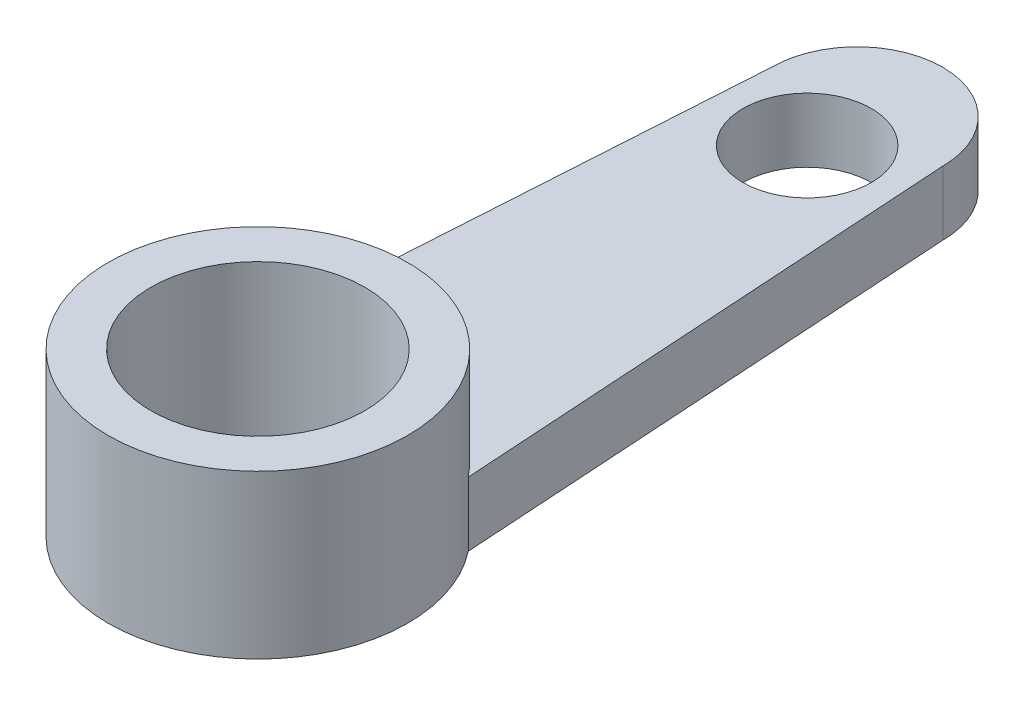
ISO-10303-21;
HEADER;
FILE_DESCRIPTION(('STEP AP214'),'2;1');
FILE_NAME('part.step','',(''),(''),'','','');
FILE_SCHEMA(('AUTOMOTIVE_DESIGN { 1 0 10303 214 1 1 1 1 }'));
ENDSEC;
DATA;
#1=APPLICATION_CONTEXT('core data for automotive mechanical design processes');
#2=APPLICATION_PROTOCOL_DEFINITION('international standard','automotive_design',2000,#1);
#3=PRODUCT_CONTEXT('',#1,'mechanical');
#4=PRODUCT('Part','Part','',(#3));
#5=PRODUCT_RELATED_PRODUCT_CATEGORY('part','',(#4));
#6=PRODUCT_DEFINITION_FORMATION('','',#4);
#7=PRODUCT_DEFINITION_CONTEXT('part definition',#1,'design');
#8=PRODUCT_DEFINITION('design','',#6,#7);
#9=PRODUCT_DEFINITION_SHAPE('','',#8);
#10=(LENGTH_UNIT() NAMED_UNIT(*) SI_UNIT(.MILLI.,.METRE.));
#11=(NAMED_UNIT(*) PLANE_ANGLE_UNIT() SI_UNIT($,.RADIAN.));
#12=(NAMED_UNIT(*) SI_UNIT($,.STERADIAN.) SOLID_ANGLE_UNIT());
#13=UNCERTAINTY_MEASURE_WITH_UNIT(LENGTH_MEASURE(1.E-05),#10,'distance_accuracy_value','');
#14=(GEOMETRIC_REPRESENTATION_CONTEXT(3) GLOBAL_UNCERTAINTY_ASSIGNED_CONTEXT((#13)) GLOBAL_UNIT_ASSIGNED_CONTEXT((#10,
#11,#12)) REPRESENTATION_CONTEXT('',''));
#15=CARTESIAN_POINT('',(0.,0.,0.));
#16=DIRECTION('',(0.,0.,1.));
#17=DIRECTION('',(1.,0.,0.));
#18=AXIS2_PLACEMENT_3D('',#15,#16,#17);
#19=CARTESIAN_POINT('',(-26.838191939019,1.5,1.70078174651427));
#20=DIRECTION('',(-0.997998041901068,0.,0.0632448287343294));
#21=DIRECTION('',(0.0632448287343294,0.,0.997998041901068));
#22=AXIS2_PLACEMENT_3D('',#19,#20,#21);
#23=PLANE('',#22);
#24=DIRECTION('',(-0.0632448287343294,0.,-0.997998041901068));
#25=VECTOR('',#24,1.);
#26=CARTESIAN_POINT('',(-26.838191939019,0.,1.70078174651427));
#27=LINE('',#26,#25);
#28=CARTESIAN_POINT('',(-24.9045880317182,0.,32.2128876675313));
#29=VERTEX_POINT('',#28);
#30=CARTESIAN_POINT('',(-25.6545880317182,0.,20.3779511769924));
#31=VERTEX_POINT('',#30);
#32=EDGE_CURVE('E82',#29,#31,#27,.T.);
#33=ORIENTED_EDGE('',*,*,#32,.T.);
#34=DIRECTION('',(0.,-1.,0.));
#35=VECTOR('',#34,1.);
#36=CARTESIAN_POINT('',(-25.6545880317182,1.5,20.3779511769924));
#37=LINE('',#36,#35);
#38=CARTESIAN_POINT('',(-25.6545880317182,1.5,20.3779511769924));
#39=VERTEX_POINT('',#38);
#40=EDGE_CURVE('E11',#39,#31,#37,.T.);
#41=ORIENTED_EDGE('',*,*,#40,.F.);
#42=DIRECTION('',(-0.0632448287343294,0.,-0.997998041901068));
#43=VECTOR('',#42,1.);
#44=CARTESIAN_POINT('',(-26.838191939019,1.5,1.70078174651427));
#45=LINE('',#44,#43);
#46=CARTESIAN_POINT('',(-24.9045880317182,1.5,32.2128876675313));
#47=VERTEX_POINT('',#46);
#48=EDGE_CURVE('E103',#47,#39,#45,.T.);
#49=ORIENTED_EDGE('',*,*,#48,.F.);
#50=DIRECTION('',(0.,-1.,0.));
#51=VECTOR('',#50,1.);
#52=CARTESIAN_POINT('',(-24.9045880317182,1.5,32.2128876675313));
#53=LINE('',#52,#51);
#54=EDGE_CURVE('E96',#47,#29,#53,.T.);
#55=ORIENTED_EDGE('',*,*,#54,.T.);
#56=EDGE_LOOP('',(#33,#41,#49,#55));
#57=FACE_BOUND('',#56,.T.);
#58=ADVANCED_FACE('F40',(#57),#23,.F.);
#59=CARTESIAN_POINT('',(-27.6545880317182,1.5,20.3779511769924));
#60=DIRECTION('',(0.,-1.,0.));
#61=DIRECTION('',(0.,0.,-1.));
#62=AXIS2_PLACEMENT_3D('',#59,#60,#61);
#63=CYLINDRICAL_SURFACE('',#62,2.);
#64=CARTESIAN_POINT('',(-27.6545880317182,0.,20.3779511769924));
#65=DIRECTION('',(0.,1.,0.));
#66=DIRECTION('',(0.,0.,1.));
#67=AXIS2_PLACEMENT_3D('',#64,#65,#66);
#68=CIRCLE('',#67,2.);
#69=CARTESIAN_POINT('',(-29.6545880317182,0.,20.3779511769924));
#70=VERTEX_POINT('',#69);
#71=EDGE_CURVE('E100',#31,#70,#68,.T.);
#72=ORIENTED_EDGE('',*,*,#71,.T.);
#73=DIRECTION('',(0.,-1.,0.));
#74=VECTOR('',#73,1.);
#75=CARTESIAN_POINT('',(-29.6545880317182,1.5,20.3779511769924));
#76=LINE('',#75,#74);
#77=CARTESIAN_POINT('',(-29.6545880317182,1.5,20.3779511769924));
#78=VERTEX_POINT('',#77);
#79=EDGE_CURVE('E48',#78,#70,#76,.T.);
#80=ORIENTED_EDGE('',*,*,#79,.F.);
#81=CARTESIAN_POINT('',(-27.6545880317182,1.5,20.3779511769924));
#82=DIRECTION('',(0.,1.,0.));
#83=DIRECTION('',(0.,0.,1.));
#84=AXIS2_PLACEMENT_3D('',#81,#82,#83);
#85=CIRCLE('',#84,2.);
#86=EDGE_CURVE('E56',#39,#78,#85,.T.);
#87=ORIENTED_EDGE('',*,*,#86,.F.);
#88=ORIENTED_EDGE('',*,*,#40,.T.);
#89=EDGE_LOOP('',(#72,#80,#87,#88));
#90=FACE_BOUND('',#89,.T.);
#91=ADVANCED_FACE('F135',(#90),#63,.T.);
#92=CARTESIAN_POINT('',(-28.2497524886062,1.5,-1.79023473285151));
#93=DIRECTION('',(-0.997998041901068,0.,-0.0632448287343294));
#94=DIRECTION('',(-0.0632448287343294,0.,0.997998041901068));
#95=AXIS2_PLACEMENT_3D('',#92,#93,#94);
#96=PLANE('',#95);
#97=DIRECTION('',(0.0632448287343294,0.,-0.997998041901068));
#98=VECTOR('',#97,1.);
#99=CARTESIAN_POINT('',(-28.2497524886062,0.,-1.79023473285151));
#100=LINE('',#99,#98);
#101=CARTESIAN_POINT('',(-30.4045880317182,0.,32.2128876675313));
#102=VERTEX_POINT('',#101);
#103=EDGE_CURVE('E79',#102,#70,#100,.T.);
#104=ORIENTED_EDGE('',*,*,#103,.F.);
#105=DIRECTION('',(0.,-1.,0.));
#106=VECTOR('',#105,1.);
#107=CARTESIAN_POINT('',(-30.4045880317182,1.5,32.2128876675313));
#108=LINE('',#107,#106);
#109=CARTESIAN_POINT('',(-30.4045880317182,1.5,32.2128876675313));
#110=VERTEX_POINT('',#109);
#111=EDGE_CURVE('E91',#110,#102,#108,.T.);
#112=ORIENTED_EDGE('',*,*,#111,.F.);
#113=DIRECTION('',(0.0632448287343294,0.,-0.997998041901068));
#114=VECTOR('',#113,1.);
#115=CARTESIAN_POINT('',(-28.2497524886062,1.5,-1.79023473285151));
#116=LINE('',#115,#114);
#117=EDGE_CURVE('E115',#110,#78,#116,.T.);
#118=ORIENTED_EDGE('',*,*,#117,.T.);
#119=ORIENTED_EDGE('',*,*,#79,.T.);
#120=EDGE_LOOP('',(#104,#112,#118,#119));
#121=FACE_BOUND('',#120,.T.);
#122=ADVANCED_FACE('F98',(#121),#96,.T.);
#123=CARTESIAN_POINT('',(-27.6545880317182,1.5,21.5452258094615));
#124=DIRECTION('',(0.,-1.,0.));
#125=DIRECTION('',(0.,0.,-1.));
#126=AXIS2_PLACEMENT_3D('',#123,#124,#125);
#127=CYLINDRICAL_SURFACE('',#126,1.5);
#128=CARTESIAN_POINT('',(-27.6545880317182,1.5,21.5452258094615));
#129=DIRECTION('',(0.,1.,0.));
#130=DIRECTION('',(0.,0.,1.));
#131=AXIS2_PLACEMENT_3D('',#128,#129,#130);
#132=CIRCLE('',#131,1.5);
#133=CARTESIAN_POINT('',(-27.6545880317182,1.5,23.0452258094615));
#134=VERTEX_POINT('',#133);
#135=EDGE_CURVE('E108',#134,#134,#132,.T.);
#136=ORIENTED_EDGE('',*,*,#135,.T.);
#137=EDGE_LOOP('',(#136));
#138=FACE_BOUND('',#137,.T.);
#139=CARTESIAN_POINT('',(-27.6545880317182,0.,21.5452258094615));
#140=DIRECTION('',(0.,1.,0.));
#141=DIRECTION('',(0.,0.,1.));
#142=AXIS2_PLACEMENT_3D('',#139,#140,#141);
#143=CIRCLE('',#142,1.5);
#144=CARTESIAN_POINT('',(-27.6545880317182,0.,23.0452258094615));
#145=VERTEX_POINT('',#144);
#146=EDGE_CURVE('E99',#145,#145,#143,.T.);
#147=ORIENTED_EDGE('',*,*,#146,.F.);
#148=EDGE_LOOP('',(#147));
#149=FACE_BOUND('',#148,.T.);
#150=ADVANCED_FACE('F141',(#138,#149),#127,.F.);
#151=CARTESIAN_POINT('',(0.,1.5,0.));
#152=DIRECTION('',(0.,1.,0.));
#153=DIRECTION('',(0.,0.,1.));
#154=AXIS2_PLACEMENT_3D('',#151,#152,#153);
#155=PLANE('',#154);
#156=ORIENTED_EDGE('',*,*,#48,.T.);
#157=ORIENTED_EDGE('',*,*,#86,.T.);
#158=ORIENTED_EDGE('',*,*,#117,.F.);
#159=CARTESIAN_POINT('',(-27.6545880317182,1.5,34.3779511769924));
#160=DIRECTION('',(0.,1.,0.));
#161=DIRECTION('',(0.,0.,1.));
#162=AXIS2_PLACEMENT_3D('',#159,#160,#161);
#163=CIRCLE('',#162,3.5);
#164=EDGE_CURVE('E95',#47,#110,#163,.T.);
#165=ORIENTED_EDGE('',*,*,#164,.F.);
#166=EDGE_LOOP('',(#156,#157,#158,#165));
#167=FACE_BOUND('',#166,.T.);
#168=ORIENTED_EDGE('',*,*,#135,.F.);
#169=EDGE_LOOP('',(#168));
#170=FACE_BOUND('',#169,.T.);
#171=ADVANCED_FACE('F130',(#167,#170),#155,.T.);
#172=CARTESIAN_POINT('',(0.,0.,0.));
#173=DIRECTION('',(0.,1.,0.));
#174=DIRECTION('',(0.,0.,1.));
#175=AXIS2_PLACEMENT_3D('',#172,#173,#174);
#176=PLANE('',#175);
#177=ORIENTED_EDGE('',*,*,#32,.F.);
#178=CARTESIAN_POINT('',(-27.6545880317182,0.,34.3779511769924));
#179=DIRECTION('',(0.,1.,0.));
#180=DIRECTION('',(0.,0.,1.));
#181=AXIS2_PLACEMENT_3D('',#178,#179,#180);
#182=CIRCLE('',#181,3.5);
#183=EDGE_CURVE('E75',#102,#29,#182,.T.);
#184=ORIENTED_EDGE('',*,*,#183,.F.);
#185=ORIENTED_EDGE('',*,*,#103,.T.);
#186=ORIENTED_EDGE('',*,*,#71,.F.);
#187=EDGE_LOOP('',(#177,#184,#185,#186));
#188=FACE_BOUND('',#187,.T.);
#189=ORIENTED_EDGE('',*,*,#146,.T.);
#190=EDGE_LOOP('',(#189));
#191=FACE_BOUND('',#190,.T.);
#192=CARTESIAN_POINT('',(-27.6545880317182,0.,34.3779511769924));
#193=DIRECTION('',(0.,1.,0.));
#194=DIRECTION('',(0.,0.,1.));
#195=AXIS2_PLACEMENT_3D('',#192,#193,#194);
#196=CIRCLE('',#195,2.5);
#197=CARTESIAN_POINT('',(-27.6545880317182,0.,31.8779511769924));
#198=VERTEX_POINT('',#197);
#199=EDGE_CURVE('E87',#198,#198,#196,.T.);
#200=ORIENTED_EDGE('',*,*,#199,.T.);
#201=EDGE_LOOP('',(#200));
#202=FACE_BOUND('',#201,.T.);
#203=ADVANCED_FACE('F77',(#188,#191,#202),#176,.F.);
#204=CARTESIAN_POINT('',(-27.6545880317182,3.8,34.3779511769924));
#205=DIRECTION('',(0.,-1.,0.));
#206=DIRECTION('',(0.,0.,-1.));
#207=AXIS2_PLACEMENT_3D('',#204,#205,#206);
#208=CYLINDRICAL_SURFACE('',#207,3.5);
#209=CARTESIAN_POINT('',(-27.6545880317182,3.8,34.3779511769924));
#210=DIRECTION('',(0.,1.,0.));
#211=DIRECTION('',(0.,0.,1.));
#212=AXIS2_PLACEMENT_3D('',#209,#210,#211);
#213=CIRCLE('',#212,3.5);
#214=CARTESIAN_POINT('',(-27.6545880317182,3.8,37.8779511769924));
#215=VERTEX_POINT('',#214);
#216=EDGE_CURVE('E118',#215,#215,#213,.T.);
#217=ORIENTED_EDGE('',*,*,#216,.F.);
#218=EDGE_LOOP('',(#217));
#219=FACE_BOUND('',#218,.T.);
#220=ORIENTED_EDGE('',*,*,#183,.T.);
#221=ORIENTED_EDGE('',*,*,#54,.F.);
#222=ORIENTED_EDGE('',*,*,#164,.T.);
#223=ORIENTED_EDGE('',*,*,#111,.T.);
#224=EDGE_LOOP('',(#220,#221,#222,#223));
#225=FACE_BOUND('',#224,.T.);
#226=ADVANCED_FACE('F92',(#219,#225),#208,.T.);
#227=CARTESIAN_POINT('',(-27.6545880317182,3.8,34.3779511769924));
#228=DIRECTION('',(0.,-1.,0.));
#229=DIRECTION('',(0.,0.,-1.));
#230=AXIS2_PLACEMENT_3D('',#227,#228,#229);
#231=CYLINDRICAL_SURFACE('',#230,2.5);
#232=CARTESIAN_POINT('',(-27.6545880317182,3.8,34.3779511769924));
#233=DIRECTION('',(0.,1.,0.));
#234=DIRECTION('',(0.,0.,1.));
#235=AXIS2_PLACEMENT_3D('',#232,#233,#234);
#236=CIRCLE('',#235,2.5);
#237=CARTESIAN_POINT('',(-27.6545880317182,3.8,31.8779511769924));
#238=VERTEX_POINT('',#237);
#239=EDGE_CURVE('E86',#238,#238,#236,.T.);
#240=CARTESIAN_POINT('',(-27.6545880317182,3.8,31.8779511769924));
#241=CARTESIAN_POINT('',(-27.6545880317182,3.76041666666667,31.8779511769924));
#242=CARTESIAN_POINT('',(-27.6545880317182,3.72083333333333,31.8779511769924));
#243=CARTESIAN_POINT('',(-27.6545880317182,3.64166666666667,31.8779511769924));
#244=CARTESIAN_POINT('',(-27.6545880317182,3.60208333333333,31.8779511769924));
#245=CARTESIAN_POINT('',(-27.6545880317182,3.52291666666667,31.8779511769924));
#246=CARTESIAN_POINT('',(-27.6545880317182,3.48333333333333,31.8779511769924));
#247=CARTESIAN_POINT('',(-27.6545880317182,3.40416666666667,31.8779511769924));
#248=CARTESIAN_POINT('',(-27.6545880317182,3.36458333333333,31.8779511769924));
#249=CARTESIAN_POINT('',(-27.6545880317182,3.28541666666667,31.8779511769924));
#250=CARTESIAN_POINT('',(-27.6545880317182,3.24583333333333,31.8779511769924));
#251=CARTESIAN_POINT('',(-27.6545880317182,3.16666666666667,31.8779511769924));
#252=CARTESIAN_POINT('',(-27.6545880317182,3.12708333333333,31.8779511769924));
#253=CARTESIAN_POINT('',(-27.6545880317182,3.04791666666667,31.8779511769924));
#254=CARTESIAN_POINT('',(-27.6545880317182,3.00833333333333,31.8779511769924));
#255=CARTESIAN_POINT('',(-27.6545880317182,2.92916666666667,31.8779511769924));
#256=CARTESIAN_POINT('',(-27.6545880317182,2.88958333333333,31.8779511769924));
#257=CARTESIAN_POINT('',(-27.6545880317182,2.81041666666667,31.8779511769924));
#258=CARTESIAN_POINT('',(-27.6545880317182,2.77083333333333,31.8779511769924));
#259=CARTESIAN_POINT('',(-27.6545880317182,2.69166666666667,31.8779511769924));
#260=CARTESIAN_POINT('',(-27.6545880317182,2.65208333333333,31.8779511769924));
#261=CARTESIAN_POINT('',(-27.6545880317182,2.57291666666667,31.8779511769924));
#262=CARTESIAN_POINT('',(-27.6545880317182,2.53333333333333,31.8779511769924));
#263=CARTESIAN_POINT('',(-27.6545880317182,2.45416666666667,31.8779511769924));
#264=CARTESIAN_POINT('',(-27.6545880317182,2.41458333333333,31.8779511769924));
#265=CARTESIAN_POINT('',(-27.6545880317182,2.33541666666667,31.8779511769924));
#266=CARTESIAN_POINT('',(-27.6545880317182,2.29583333333333,31.8779511769924));
#267=CARTESIAN_POINT('',(-27.6545880317182,2.21666666666667,31.8779511769924));
#268=CARTESIAN_POINT('',(-27.6545880317182,2.17708333333333,31.8779511769924));
#269=CARTESIAN_POINT('',(-27.6545880317182,2.09791666666667,31.8779511769924));
#270=CARTESIAN_POINT('',(-27.6545880317182,2.05833333333333,31.8779511769924));
#271=CARTESIAN_POINT('',(-27.6545880317182,1.97916666666667,31.8779511769924));
#272=CARTESIAN_POINT('',(-27.6545880317182,1.93958333333333,31.8779511769924));
#273=CARTESIAN_POINT('',(-27.6545880317182,1.86041666666667,31.8779511769924));
#274=CARTESIAN_POINT('',(-27.6545880317182,1.82083333333333,31.8779511769924));
#275=CARTESIAN_POINT('',(-27.6545880317182,1.74166666666667,31.8779511769924));
#276=CARTESIAN_POINT('',(-27.6545880317182,1.70208333333333,31.8779511769924));
#277=CARTESIAN_POINT('',(-27.6545880317182,1.62291666666667,31.8779511769924));
#278=CARTESIAN_POINT('',(-27.6545880317182,1.58333333333333,31.8779511769924));
#279=CARTESIAN_POINT('',(-27.6545880317182,1.50416666666667,31.8779511769924));
#280=CARTESIAN_POINT('',(-27.6545880317182,1.46458333333333,31.8779511769924));
#281=CARTESIAN_POINT('',(-27.6545880317182,1.38541666666667,31.8779511769924));
#282=CARTESIAN_POINT('',(-27.6545880317182,1.34583333333333,31.8779511769924));
#283=CARTESIAN_POINT('',(-27.6545880317182,1.26666666666667,31.8779511769924));
#284=CARTESIAN_POINT('',(-27.6545880317182,1.22708333333333,31.8779511769924));
#285=CARTESIAN_POINT('',(-27.6545880317182,1.14791666666667,31.8779511769924));
#286=CARTESIAN_POINT('',(-27.6545880317182,1.10833333333333,31.8779511769924));
#287=CARTESIAN_POINT('',(-27.6545880317182,1.02916666666667,31.8779511769924));
#288=CARTESIAN_POINT('',(-27.6545880317182,0.989583333333334,31.8779511769924));
#289=CARTESIAN_POINT('',(-27.6545880317182,0.910416666666667,31.8779511769924));
#290=CARTESIAN_POINT('',(-27.6545880317182,0.870833333333333,31.8779511769924));
#291=CARTESIAN_POINT('',(-27.6545880317182,0.791666666666667,31.8779511769924));
#292=CARTESIAN_POINT('',(-27.6545880317182,0.752083333333333,31.8779511769924));
#293=CARTESIAN_POINT('',(-27.6545880317182,0.672916666666667,31.8779511769924));
#294=CARTESIAN_POINT('',(-27.6545880317182,0.633333333333333,31.8779511769924));
#295=CARTESIAN_POINT('',(-27.6545880317182,0.554166666666667,31.8779511769924));
#296=CARTESIAN_POINT('',(-27.6545880317182,0.514583333333334,31.8779511769924));
#297=CARTESIAN_POINT('',(-27.6545880317182,0.435416666666667,31.8779511769924));
#298=CARTESIAN_POINT('',(-27.6545880317182,0.395833333333334,31.8779511769924));
#299=CARTESIAN_POINT('',(-27.6545880317182,0.316666666666667,31.8779511769924));
#300=CARTESIAN_POINT('',(-27.6545880317182,0.277083333333333,31.8779511769924));
#301=CARTESIAN_POINT('',(-27.6545880317182,0.197916666666667,31.8779511769924));
#302=CARTESIAN_POINT('',(-27.6545880317182,0.158333333333333,31.8779511769924));
#303=CARTESIAN_POINT('',(-27.6545880317182,0.0791666666666666,31.8779511769924));
#304=CARTESIAN_POINT('',(-27.6545880317182,0.0395833333333333,31.8779511769924));
#305=CARTESIAN_POINT('',(-27.6545880317182,0.,31.8779511769924));
#306=B_SPLINE_CURVE_WITH_KNOTS('',3,(#240,#241,#242,#243,#244,#245,#246,#247,#248,#249,#250,
#251,#252,#253,#254,#255,#256,#257,#258,#259,#260,#261,#262,#263,#264,#265,#266,#267,#268,#269,
#270,#271,#272,#273,#274,#275,#276,#277,#278,#279,#280,#281,#282,#283,#284,#285,#286,#287,#288,
#289,#290,#291,#292,#293,#294,#295,#296,#297,#298,#299,#300,#301,#302,#303,#304,#305),
.UNSPECIFIED.,.F.,.F.,(4,2,2,2,2,2,2,2,2,2,2,2,2,2,2,2,2,2,2,2,2,2,2,2,2,2,2,2,2,2,2,2,4),(0.,
0.11875,0.2375,0.35625,0.475,0.59375,0.7125,0.83125,0.95,1.06875,1.1875,1.30625,1.425,1.54375,
1.6625,1.78125,1.9,2.01875,2.1375,2.25625,2.375,2.49375,2.6125,2.73125,2.85,2.96875,3.0875,
3.20625,3.325,3.44375,3.5625,3.68125,3.8),.UNSPECIFIED.);
#307=EDGE_CURVE('BSEAM150',#238,#198,#306,.T.);
#308=ORIENTED_EDGE('',*,*,#239,.T.);
#309=ORIENTED_EDGE('',*,*,#199,.F.);
#310=ORIENTED_EDGE('',*,*,#307,.T.);
#311=ORIENTED_EDGE('',*,*,#307,.F.);
#312=EDGE_LOOP('',(#308,#310,#309,#311));
#313=FACE_BOUND('',#312,.T.);
#314=ADVANCED_FACE('F150',(#313),#231,.F.);
#315=CARTESIAN_POINT('',(0.,3.8,0.));
#316=DIRECTION('',(0.,1.,0.));
#317=DIRECTION('',(0.,0.,1.));
#318=AXIS2_PLACEMENT_3D('',#315,#316,#317);
#319=PLANE('',#318);
#320=ORIENTED_EDGE('',*,*,#239,.F.);
#321=EDGE_LOOP('',(#320));
#322=FACE_BOUND('',#321,.T.);
#323=ORIENTED_EDGE('',*,*,#216,.T.);
#324=EDGE_LOOP('',(#323));
#325=FACE_BOUND('',#324,.T.);
#326=ADVANCED_FACE('F153',(#322,#325),#319,.T.);
#327=CLOSED_SHELL('',(#58,#91,#122,#150,#171,#203,#226,#314,#326));
#328=MANIFOLD_SOLID_BREP('B2',#327);
#329=ADVANCED_BREP_SHAPE_REPRESENTATION('',(#18,#328),#14);
#330=SHAPE_DEFINITION_REPRESENTATION(#9,#329);
ENDSEC;
END-ISO-10303-21;
